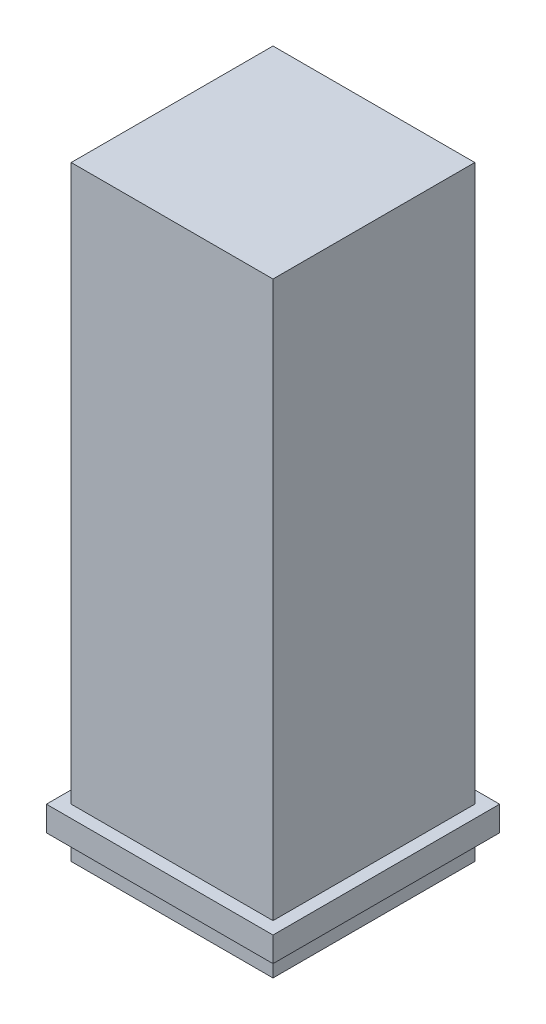
ISO-10303-21;
HEADER;
FILE_DESCRIPTION(('STEP AP214'),'2;1');
FILE_NAME('part.step','',(''),(''),'','','');
FILE_SCHEMA(('AUTOMOTIVE_DESIGN { 1 0 10303 214 1 1 1 1 }'));
ENDSEC;
DATA;
#1=APPLICATION_CONTEXT('core data for automotive mechanical design processes');
#2=APPLICATION_PROTOCOL_DEFINITION('international standard','automotive_design',2000,#1);
#3=PRODUCT_CONTEXT('',#1,'mechanical');
#4=PRODUCT('Part','Part','',(#3));
#5=PRODUCT_RELATED_PRODUCT_CATEGORY('part','',(#4));
#6=PRODUCT_DEFINITION_FORMATION('','',#4);
#7=PRODUCT_DEFINITION_CONTEXT('part definition',#1,'design');
#8=PRODUCT_DEFINITION('design','',#6,#7);
#9=PRODUCT_DEFINITION_SHAPE('','',#8);
#10=(LENGTH_UNIT() NAMED_UNIT(*) SI_UNIT(.MILLI.,.METRE.));
#11=(NAMED_UNIT(*) PLANE_ANGLE_UNIT() SI_UNIT($,.RADIAN.));
#12=(NAMED_UNIT(*) SI_UNIT($,.STERADIAN.) SOLID_ANGLE_UNIT());
#13=UNCERTAINTY_MEASURE_WITH_UNIT(LENGTH_MEASURE(1.E-05),#10,'distance_accuracy_value','');
#14=(GEOMETRIC_REPRESENTATION_CONTEXT(3) GLOBAL_UNCERTAINTY_ASSIGNED_CONTEXT((#13)) GLOBAL_UNIT_ASSIGNED_CONTEXT((#10,
#11,#12)) REPRESENTATION_CONTEXT('',''));
#15=CARTESIAN_POINT('',(0.,0.,0.));
#16=DIRECTION('',(0.,0.,1.));
#17=DIRECTION('',(1.,0.,0.));
#18=AXIS2_PLACEMENT_3D('',#15,#16,#17);
#19=CARTESIAN_POINT('',(0.,2438.4,0.));
#20=DIRECTION('',(1.,0.,0.));
#21=DIRECTION('',(0.,0.,-1.));
#22=AXIS2_PLACEMENT_3D('',#19,#20,#21);
#23=PLANE('',#22);
#24=DIRECTION('',(0.,0.,1.));
#25=VECTOR('',#24,1.);
#26=CARTESIAN_POINT('',(0.,200.,0.));
#27=LINE('',#26,#25);
#28=CARTESIAN_POINT('',(0.,200.000000000001,-812.8));
#29=VERTEX_POINT('',#28);
#30=CARTESIAN_POINT('',(0.,200.000000000001,0.));
#31=VERTEX_POINT('',#30);
#32=EDGE_CURVE('E48',#29,#31,#27,.T.);
#33=ORIENTED_EDGE('',*,*,#32,.T.);
#34=DIRECTION('',(0.,-1.,0.));
#35=VECTOR('',#34,1.);
#36=CARTESIAN_POINT('',(0.,2438.4,0.));
#37=LINE('',#36,#35);
#38=CARTESIAN_POINT('',(0.,2438.4,0.));
#39=VERTEX_POINT('',#38);
#40=EDGE_CURVE('E11',#39,#31,#37,.T.);
#41=ORIENTED_EDGE('',*,*,#40,.F.);
#42=DIRECTION('',(0.,0.,1.));
#43=VECTOR('',#42,1.);
#44=CARTESIAN_POINT('',(0.,2438.4,0.));
#45=LINE('',#44,#43);
#46=CARTESIAN_POINT('',(0.,2438.4,-812.8));
#47=VERTEX_POINT('',#46);
#48=EDGE_CURVE('E160',#47,#39,#45,.T.);
#49=ORIENTED_EDGE('',*,*,#48,.F.);
#50=DIRECTION('',(0.,-1.,0.));
#51=VECTOR('',#50,1.);
#52=CARTESIAN_POINT('',(0.,2438.4,-812.8));
#53=LINE('',#52,#51);
#54=EDGE_CURVE('E154',#47,#29,#53,.T.);
#55=ORIENTED_EDGE('',*,*,#54,.T.);
#56=EDGE_LOOP('',(#33,#41,#49,#55));
#57=FACE_BOUND('',#56,.T.);
#58=ADVANCED_FACE('F33',(#57),#23,.F.);
#59=CARTESIAN_POINT('',(0.,2438.4,0.));
#60=DIRECTION('',(0.,0.,-1.));
#61=DIRECTION('',(-1.,0.,0.));
#62=AXIS2_PLACEMENT_3D('',#59,#60,#61);
#63=PLANE('',#62);
#64=DIRECTION('',(1.,0.,0.));
#65=VECTOR('',#64,1.);
#66=CARTESIAN_POINT('',(0.,200.,0.));
#67=LINE('',#66,#65);
#68=CARTESIAN_POINT('',(812.8,200.000000000001,0.));
#69=VERTEX_POINT('',#68);
#70=EDGE_CURVE('E54',#31,#69,#67,.T.);
#71=ORIENTED_EDGE('',*,*,#70,.T.);
#72=DIRECTION('',(0.,-1.,0.));
#73=VECTOR('',#72,1.);
#74=CARTESIAN_POINT('',(812.8,2438.4,0.));
#75=LINE('',#74,#73);
#76=CARTESIAN_POINT('',(812.8,2438.4,0.));
#77=VERTEX_POINT('',#76);
#78=EDGE_CURVE('E145',#77,#69,#75,.T.);
#79=ORIENTED_EDGE('',*,*,#78,.F.);
#80=DIRECTION('',(1.,0.,0.));
#81=VECTOR('',#80,1.);
#82=CARTESIAN_POINT('',(0.,2438.4,0.));
#83=LINE('',#82,#81);
#84=EDGE_CURVE('E172',#39,#77,#83,.T.);
#85=ORIENTED_EDGE('',*,*,#84,.F.);
#86=ORIENTED_EDGE('',*,*,#40,.T.);
#87=EDGE_LOOP('',(#71,#79,#85,#86));
#88=FACE_BOUND('',#87,.T.);
#89=ADVANCED_FACE('F224',(#88),#63,.F.);
#90=CARTESIAN_POINT('',(812.8,2438.4,0.));
#91=DIRECTION('',(-1.,0.,0.));
#92=DIRECTION('',(0.,0.,1.));
#93=AXIS2_PLACEMENT_3D('',#90,#91,#92);
#94=PLANE('',#93);
#95=DIRECTION('',(0.,0.,-1.));
#96=VECTOR('',#95,1.);
#97=CARTESIAN_POINT('',(812.8,200.,0.));
#98=LINE('',#97,#96);
#99=CARTESIAN_POINT('',(812.8,200.,-812.8));
#100=VERTEX_POINT('',#99);
#101=EDGE_CURVE('E209',#69,#100,#98,.T.);
#102=ORIENTED_EDGE('',*,*,#101,.T.);
#103=DIRECTION('',(0.,-1.,0.));
#104=VECTOR('',#103,1.);
#105=CARTESIAN_POINT('',(812.8,2438.4,-812.8));
#106=LINE('',#105,#104);
#107=CARTESIAN_POINT('',(812.8,2438.4,-812.8));
#108=VERTEX_POINT('',#107);
#109=EDGE_CURVE('E150',#108,#100,#106,.T.);
#110=ORIENTED_EDGE('',*,*,#109,.F.);
#111=DIRECTION('',(0.,0.,-1.));
#112=VECTOR('',#111,1.);
#113=CARTESIAN_POINT('',(812.8,2438.4,0.));
#114=LINE('',#113,#112);
#115=EDGE_CURVE('E170',#77,#108,#114,.T.);
#116=ORIENTED_EDGE('',*,*,#115,.F.);
#117=ORIENTED_EDGE('',*,*,#78,.T.);
#118=EDGE_LOOP('',(#102,#110,#116,#117));
#119=FACE_BOUND('',#118,.T.);
#120=ADVANCED_FACE('F214',(#119),#94,.F.);
#121=CARTESIAN_POINT('',(0.,2438.4,-812.8));
#122=DIRECTION('',(0.,0.,1.));
#123=DIRECTION('',(1.,0.,0.));
#124=AXIS2_PLACEMENT_3D('',#121,#122,#123);
#125=PLANE('',#124);
#126=DIRECTION('',(-1.,0.,0.));
#127=VECTOR('',#126,1.);
#128=CARTESIAN_POINT('',(-2.22044604925031E-13,200.,-812.8));
#129=LINE('',#128,#127);
#130=EDGE_CURVE('E198',#100,#29,#129,.T.);
#131=ORIENTED_EDGE('',*,*,#130,.T.);
#132=ORIENTED_EDGE('',*,*,#54,.F.);
#133=DIRECTION('',(-1.,0.,0.));
#134=VECTOR('',#133,1.);
#135=CARTESIAN_POINT('',(0.,2438.4,-812.8));
#136=LINE('',#135,#134);
#137=EDGE_CURVE('E168',#108,#47,#136,.T.);
#138=ORIENTED_EDGE('',*,*,#137,.F.);
#139=ORIENTED_EDGE('',*,*,#109,.T.);
#140=EDGE_LOOP('',(#131,#132,#138,#139));
#141=FACE_BOUND('',#140,.T.);
#142=ADVANCED_FACE('F220',(#141),#125,.F.);
#143=CARTESIAN_POINT('',(0.,2438.4,0.));
#144=DIRECTION('',(0.,-1.,0.));
#145=DIRECTION('',(0.,0.,-1.));
#146=AXIS2_PLACEMENT_3D('',#143,#144,#145);
#147=PLANE('',#146);
#148=ORIENTED_EDGE('',*,*,#48,.T.);
#149=ORIENTED_EDGE('',*,*,#84,.T.);
#150=ORIENTED_EDGE('',*,*,#115,.T.);
#151=ORIENTED_EDGE('',*,*,#137,.T.);
#152=EDGE_LOOP('',(#148,#149,#150,#151));
#153=FACE_BOUND('',#152,.T.);
#154=ADVANCED_FACE('F223',(#153),#147,.F.);
#155=CARTESIAN_POINT('',(0.,200.,0.));
#156=DIRECTION('',(0.,-1.,0.));
#157=DIRECTION('',(0.,0.,-1.));
#158=AXIS2_PLACEMENT_3D('',#155,#156,#157);
#159=PLANE('',#158);
#160=DIRECTION('',(0.,0.,1.));
#161=VECTOR('',#160,1.);
#162=CARTESIAN_POINT('',(-50.,200.,50.));
#163=LINE('',#162,#161);
#164=CARTESIAN_POINT('',(-50.0000000000002,200.,-862.8));
#165=VERTEX_POINT('',#164);
#166=CARTESIAN_POINT('',(-50.,200.,50.));
#167=VERTEX_POINT('',#166);
#168=EDGE_CURVE('E190',#165,#167,#163,.T.);
#169=ORIENTED_EDGE('',*,*,#168,.T.);
#170=DIRECTION('',(1.,0.,0.));
#171=VECTOR('',#170,1.);
#172=CARTESIAN_POINT('',(-50.,200.,50.));
#173=LINE('',#172,#171);
#174=CARTESIAN_POINT('',(862.8,200.,50.));
#175=VERTEX_POINT('',#174);
#176=EDGE_CURVE('E202',#167,#175,#173,.T.);
#177=ORIENTED_EDGE('',*,*,#176,.T.);
#178=DIRECTION('',(0.,0.,-1.));
#179=VECTOR('',#178,1.);
#180=CARTESIAN_POINT('',(862.8,200.,50.));
#181=LINE('',#180,#179);
#182=CARTESIAN_POINT('',(862.8,200.,-862.8));
#183=VERTEX_POINT('',#182);
#184=EDGE_CURVE('E200',#175,#183,#181,.T.);
#185=ORIENTED_EDGE('',*,*,#184,.T.);
#186=DIRECTION('',(-1.,0.,0.));
#187=VECTOR('',#186,1.);
#188=CARTESIAN_POINT('',(-50.0000000000002,200.,-862.8));
#189=LINE('',#188,#187);
#190=EDGE_CURVE('E187',#183,#165,#189,.T.);
#191=ORIENTED_EDGE('',*,*,#190,.T.);
#192=EDGE_LOOP('',(#169,#177,#185,#191));
#193=FACE_BOUND('',#192,.T.);
#194=ORIENTED_EDGE('',*,*,#32,.F.);
#195=ORIENTED_EDGE('',*,*,#130,.F.);
#196=ORIENTED_EDGE('',*,*,#101,.F.);
#197=ORIENTED_EDGE('',*,*,#70,.F.);
#198=EDGE_LOOP('',(#194,#195,#196,#197));
#199=FACE_BOUND('',#198,.T.);
#200=ADVANCED_FACE('F217',(#193,#199),#159,.F.);
#201=CARTESIAN_POINT('',(0.,100.,0.));
#202=DIRECTION('',(0.,-1.,0.));
#203=DIRECTION('',(0.,0.,-1.));
#204=AXIS2_PLACEMENT_3D('',#201,#202,#203);
#205=PLANE('',#204);
#206=DIRECTION('',(0.,0.,1.));
#207=VECTOR('',#206,1.);
#208=CARTESIAN_POINT('',(-50.,100.,50.));
#209=LINE('',#208,#207);
#210=CARTESIAN_POINT('',(-50.0000000000002,100.,-862.8));
#211=VERTEX_POINT('',#210);
#212=CARTESIAN_POINT('',(-50.,100.,50.));
#213=VERTEX_POINT('',#212);
#214=EDGE_CURVE('E195',#211,#213,#209,.T.);
#215=ORIENTED_EDGE('',*,*,#214,.F.);
#216=DIRECTION('',(-1.,0.,0.));
#217=VECTOR('',#216,1.);
#218=CARTESIAN_POINT('',(-50.0000000000002,100.,-862.8));
#219=LINE('',#218,#217);
#220=CARTESIAN_POINT('',(862.8,100.,-862.8));
#221=VERTEX_POINT('',#220);
#222=EDGE_CURVE('E188',#221,#211,#219,.T.);
#223=ORIENTED_EDGE('',*,*,#222,.F.);
#224=DIRECTION('',(0.,0.,-1.));
#225=VECTOR('',#224,1.);
#226=CARTESIAN_POINT('',(862.8,100.,50.));
#227=LINE('',#226,#225);
#228=CARTESIAN_POINT('',(862.8,100.,50.));
#229=VERTEX_POINT('',#228);
#230=EDGE_CURVE('E191',#229,#221,#227,.T.);
#231=ORIENTED_EDGE('',*,*,#230,.F.);
#232=DIRECTION('',(1.,0.,0.));
#233=VECTOR('',#232,1.);
#234=CARTESIAN_POINT('',(-50.,100.,50.));
#235=LINE('',#234,#233);
#236=EDGE_CURVE('E193',#213,#229,#235,.T.);
#237=ORIENTED_EDGE('',*,*,#236,.F.);
#238=EDGE_LOOP('',(#215,#223,#231,#237));
#239=FACE_BOUND('',#238,.T.);
#240=DIRECTION('',(-1.,0.,0.));
#241=VECTOR('',#240,1.);
#242=CARTESIAN_POINT('',(-2.22044604925031E-13,100.,-812.8));
#243=LINE('',#242,#241);
#244=CARTESIAN_POINT('',(812.8,100.000000000001,-812.8));
#245=VERTEX_POINT('',#244);
#246=CARTESIAN_POINT('',(-2.22044604925031E-13,100.,-812.8));
#247=VERTEX_POINT('',#246);
#248=EDGE_CURVE('E129',#245,#247,#243,.T.);
#249=ORIENTED_EDGE('',*,*,#248,.T.);
#250=DIRECTION('',(0.,0.,1.));
#251=VECTOR('',#250,1.);
#252=CARTESIAN_POINT('',(0.,100.,0.));
#253=LINE('',#252,#251);
#254=CARTESIAN_POINT('',(0.,100.,0.));
#255=VERTEX_POINT('',#254);
#256=EDGE_CURVE('E123',#247,#255,#253,.T.);
#257=ORIENTED_EDGE('',*,*,#256,.T.);
#258=DIRECTION('',(1.,0.,0.));
#259=VECTOR('',#258,1.);
#260=CARTESIAN_POINT('',(0.,100.,0.));
#261=LINE('',#260,#259);
#262=CARTESIAN_POINT('',(812.8,100.,0.));
#263=VERTEX_POINT('',#262);
#264=EDGE_CURVE('E126',#255,#263,#261,.T.);
#265=ORIENTED_EDGE('',*,*,#264,.T.);
#266=DIRECTION('',(0.,0.,-1.));
#267=VECTOR('',#266,1.);
#268=CARTESIAN_POINT('',(812.8,100.,0.));
#269=LINE('',#268,#267);
#270=EDGE_CURVE('E140',#263,#245,#269,.T.);
#271=ORIENTED_EDGE('',*,*,#270,.T.);
#272=EDGE_LOOP('',(#249,#257,#265,#271));
#273=FACE_BOUND('',#272,.T.);
#274=ADVANCED_FACE('F125',(#239,#273),#205,.T.);
#275=CARTESIAN_POINT('',(-50.,200.,50.));
#276=DIRECTION('',(1.,0.,0.));
#277=DIRECTION('',(0.,0.,-1.));
#278=AXIS2_PLACEMENT_3D('',#275,#276,#277);
#279=PLANE('',#278);
#280=ORIENTED_EDGE('',*,*,#214,.T.);
#281=DIRECTION('',(0.,-1.,0.));
#282=VECTOR('',#281,1.);
#283=CARTESIAN_POINT('',(-50.,200.,50.));
#284=LINE('',#283,#282);
#285=EDGE_CURVE('E167',#167,#213,#284,.T.);
#286=ORIENTED_EDGE('',*,*,#285,.F.);
#287=ORIENTED_EDGE('',*,*,#168,.F.);
#288=DIRECTION('',(0.,-1.,0.));
#289=VECTOR('',#288,1.);
#290=CARTESIAN_POINT('',(-50.0000000000002,200.,-862.8));
#291=LINE('',#290,#289);
#292=EDGE_CURVE('E184',#165,#211,#291,.T.);
#293=ORIENTED_EDGE('',*,*,#292,.T.);
#294=EDGE_LOOP('',(#280,#286,#287,#293));
#295=FACE_BOUND('',#294,.T.);
#296=ADVANCED_FACE('F253',(#295),#279,.F.);
#297=CARTESIAN_POINT('',(-50.,200.,50.));
#298=DIRECTION('',(0.,0.,-1.));
#299=DIRECTION('',(-1.,0.,0.));
#300=AXIS2_PLACEMENT_3D('',#297,#298,#299);
#301=PLANE('',#300);
#302=ORIENTED_EDGE('',*,*,#236,.T.);
#303=DIRECTION('',(0.,-1.,0.));
#304=VECTOR('',#303,1.);
#305=CARTESIAN_POINT('',(862.8,200.,50.));
#306=LINE('',#305,#304);
#307=EDGE_CURVE('E178',#175,#229,#306,.T.);
#308=ORIENTED_EDGE('',*,*,#307,.F.);
#309=ORIENTED_EDGE('',*,*,#176,.F.);
#310=ORIENTED_EDGE('',*,*,#285,.T.);
#311=EDGE_LOOP('',(#302,#308,#309,#310));
#312=FACE_BOUND('',#311,.T.);
#313=ADVANCED_FACE('F256',(#312),#301,.F.);
#314=CARTESIAN_POINT('',(862.8,200.,50.));
#315=DIRECTION('',(-1.,0.,0.));
#316=DIRECTION('',(0.,0.,1.));
#317=AXIS2_PLACEMENT_3D('',#314,#315,#316);
#318=PLANE('',#317);
#319=ORIENTED_EDGE('',*,*,#230,.T.);
#320=DIRECTION('',(0.,-1.,0.));
#321=VECTOR('',#320,1.);
#322=CARTESIAN_POINT('',(862.8,200.,-862.8));
#323=LINE('',#322,#321);
#324=EDGE_CURVE('E181',#183,#221,#323,.T.);
#325=ORIENTED_EDGE('',*,*,#324,.F.);
#326=ORIENTED_EDGE('',*,*,#184,.F.);
#327=ORIENTED_EDGE('',*,*,#307,.T.);
#328=EDGE_LOOP('',(#319,#325,#326,#327));
#329=FACE_BOUND('',#328,.T.);
#330=ADVANCED_FACE('F260',(#329),#318,.F.);
#331=CARTESIAN_POINT('',(-50.0000000000002,200.,-862.8));
#332=DIRECTION('',(0.,0.,1.));
#333=DIRECTION('',(1.,0.,0.));
#334=AXIS2_PLACEMENT_3D('',#331,#332,#333);
#335=PLANE('',#334);
#336=ORIENTED_EDGE('',*,*,#222,.T.);
#337=ORIENTED_EDGE('',*,*,#292,.F.);
#338=ORIENTED_EDGE('',*,*,#190,.F.);
#339=ORIENTED_EDGE('',*,*,#324,.T.);
#340=EDGE_LOOP('',(#336,#337,#338,#339));
#341=FACE_BOUND('',#340,.T.);
#342=ADVANCED_FACE('F249',(#341),#335,.F.);
#343=CARTESIAN_POINT('',(0.,0.,0.));
#344=DIRECTION('',(0.,-1.,0.));
#345=DIRECTION('',(0.,0.,-1.));
#346=AXIS2_PLACEMENT_3D('',#343,#344,#345);
#347=PLANE('',#346);
#348=DIRECTION('',(0.,0.,1.));
#349=VECTOR('',#348,1.);
#350=CARTESIAN_POINT('',(0.,0.,0.));
#351=LINE('',#350,#349);
#352=CARTESIAN_POINT('',(0.,0.,-812.8));
#353=VERTEX_POINT('',#352);
#354=CARTESIAN_POINT('',(0.,0.,0.));
#355=VERTEX_POINT('',#354);
#356=EDGE_CURVE('E144',#353,#355,#351,.T.);
#357=ORIENTED_EDGE('',*,*,#356,.F.);
#358=DIRECTION('',(-1.,0.,0.));
#359=VECTOR('',#358,1.);
#360=CARTESIAN_POINT('',(0.,0.,-812.8));
#361=LINE('',#360,#359);
#362=CARTESIAN_POINT('',(812.8,0.,-812.8));
#363=VERTEX_POINT('',#362);
#364=EDGE_CURVE('E157',#363,#353,#361,.T.);
#365=ORIENTED_EDGE('',*,*,#364,.F.);
#366=DIRECTION('',(0.,0.,-1.));
#367=VECTOR('',#366,1.);
#368=CARTESIAN_POINT('',(812.8,0.,0.));
#369=LINE('',#368,#367);
#370=CARTESIAN_POINT('',(812.8,0.,0.));
#371=VERTEX_POINT('',#370);
#372=EDGE_CURVE('E161',#371,#363,#369,.T.);
#373=ORIENTED_EDGE('',*,*,#372,.F.);
#374=DIRECTION('',(1.,0.,0.));
#375=VECTOR('',#374,1.);
#376=CARTESIAN_POINT('',(0.,0.,0.));
#377=LINE('',#376,#375);
#378=EDGE_CURVE('E164',#355,#371,#377,.T.);
#379=ORIENTED_EDGE('',*,*,#378,.F.);
#380=EDGE_LOOP('',(#357,#365,#373,#379));
#381=FACE_BOUND('',#380,.T.);
#382=ADVANCED_FACE('F242',(#381),#347,.T.);
#383=EDGE_CURVE('E156',#247,#353,#53,.T.);
#384=ORIENTED_EDGE('',*,*,#383,.F.);
#385=ORIENTED_EDGE('',*,*,#248,.F.);
#386=EDGE_CURVE('E153',#245,#363,#106,.T.);
#387=ORIENTED_EDGE('',*,*,#386,.T.);
#388=ORIENTED_EDGE('',*,*,#364,.T.);
#389=EDGE_LOOP('',(#384,#385,#387,#388));
#390=FACE_BOUND('',#389,.T.);
#391=ADVANCED_FACE('F237',(#390),#125,.F.);
#392=ORIENTED_EDGE('',*,*,#386,.F.);
#393=ORIENTED_EDGE('',*,*,#270,.F.);
#394=EDGE_CURVE('E139',#263,#371,#75,.T.);
#395=ORIENTED_EDGE('',*,*,#394,.T.);
#396=ORIENTED_EDGE('',*,*,#372,.T.);
#397=EDGE_LOOP('',(#392,#393,#395,#396));
#398=FACE_BOUND('',#397,.T.);
#399=ADVANCED_FACE('F231',(#398),#94,.F.);
#400=ORIENTED_EDGE('',*,*,#394,.F.);
#401=ORIENTED_EDGE('',*,*,#264,.F.);
#402=EDGE_CURVE('E41',#255,#355,#37,.T.);
#403=ORIENTED_EDGE('',*,*,#402,.T.);
#404=ORIENTED_EDGE('',*,*,#378,.T.);
#405=EDGE_LOOP('',(#400,#401,#403,#404));
#406=FACE_BOUND('',#405,.T.);
#407=ADVANCED_FACE('F136',(#406),#63,.F.);
#408=ORIENTED_EDGE('',*,*,#402,.F.);
#409=ORIENTED_EDGE('',*,*,#256,.F.);
#410=ORIENTED_EDGE('',*,*,#383,.T.);
#411=ORIENTED_EDGE('',*,*,#356,.T.);
#412=EDGE_LOOP('',(#408,#409,#410,#411));
#413=FACE_BOUND('',#412,.T.);
#414=ADVANCED_FACE('F35',(#413),#23,.F.);
#415=CLOSED_SHELL('',(#58,#89,#120,#142,#154,#200,#274,#296,#313,#330,#342,#382,#391,#399,#407,#414));
#416=MANIFOLD_SOLID_BREP('B2',#415);
#417=ADVANCED_BREP_SHAPE_REPRESENTATION('',(#18,#416),#14);
#418=SHAPE_DEFINITION_REPRESENTATION(#9,#417);
ENDSEC;
END-ISO-10303-21;
